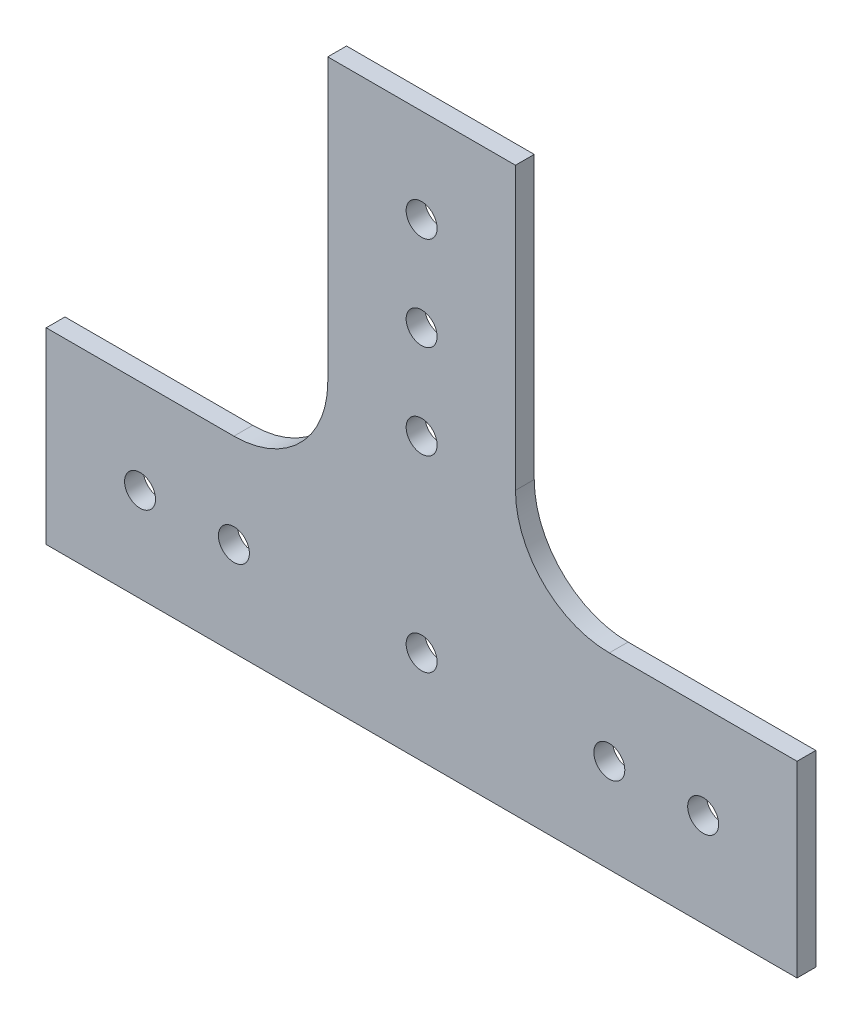
ISO-10303-21;
HEADER;
FILE_DESCRIPTION(('STEP AP214'),'2;1');
FILE_NAME('part.step','',(''),(''),'','','');
FILE_SCHEMA(('AUTOMOTIVE_DESIGN { 1 0 10303 214 1 1 1 1 }'));
ENDSEC;
DATA;
#1=APPLICATION_CONTEXT('core data for automotive mechanical design processes');
#2=APPLICATION_PROTOCOL_DEFINITION('international standard','automotive_design',2000,#1);
#3=PRODUCT_CONTEXT('',#1,'mechanical');
#4=PRODUCT('Part','Part','',(#3));
#5=PRODUCT_RELATED_PRODUCT_CATEGORY('part','',(#4));
#6=PRODUCT_DEFINITION_FORMATION('','',#4);
#7=PRODUCT_DEFINITION_CONTEXT('part definition',#1,'design');
#8=PRODUCT_DEFINITION('design','',#6,#7);
#9=PRODUCT_DEFINITION_SHAPE('','',#8);
#10=(LENGTH_UNIT() NAMED_UNIT(*) SI_UNIT(.MILLI.,.METRE.));
#11=(NAMED_UNIT(*) PLANE_ANGLE_UNIT() SI_UNIT($,.RADIAN.));
#12=(NAMED_UNIT(*) SI_UNIT($,.STERADIAN.) SOLID_ANGLE_UNIT());
#13=UNCERTAINTY_MEASURE_WITH_UNIT(LENGTH_MEASURE(1.E-05),#10,'distance_accuracy_value','');
#14=(GEOMETRIC_REPRESENTATION_CONTEXT(3) GLOBAL_UNCERTAINTY_ASSIGNED_CONTEXT((#13)) GLOBAL_UNIT_ASSIGNED_CONTEXT((#10,
#11,#12)) REPRESENTATION_CONTEXT('',''));
#15=CARTESIAN_POINT('',(0.,0.,0.));
#16=DIRECTION('',(0.,0.,1.));
#17=DIRECTION('',(1.,0.,0.));
#18=AXIS2_PLACEMENT_3D('',#15,#16,#17);
#19=CARTESIAN_POINT('',(0.,0.,2.));
#20=DIRECTION('',(0.,0.,-1.));
#21=DIRECTION('',(-1.,0.,0.));
#22=AXIS2_PLACEMENT_3D('',#19,#20,#21);
#23=PLANE('',#22);
#24=DIRECTION('',(-1.,0.,0.));
#25=VECTOR('',#24,1.);
#26=CARTESIAN_POINT('',(30.,10.,2.));
#27=LINE('',#26,#25);
#28=CARTESIAN_POINT('',(40.,10.,2.));
#29=VERTEX_POINT('',#28);
#30=CARTESIAN_POINT('',(20.,9.99999999999999,2.));
#31=VERTEX_POINT('',#30);
#32=EDGE_CURVE('E129',#29,#31,#27,.T.);
#33=ORIENTED_EDGE('',*,*,#32,.T.);
#34=CARTESIAN_POINT('',(20.,20.,2.));
#35=DIRECTION('',(0.,0.,-1.));
#36=DIRECTION('',(-1.,0.,0.));
#37=AXIS2_PLACEMENT_3D('',#34,#35,#36);
#38=CIRCLE('',#37,10.);
#39=CARTESIAN_POINT('',(10.,20.,2.));
#40=VERTEX_POINT('',#39);
#41=EDGE_CURVE('E125',#31,#40,#38,.T.);
#42=ORIENTED_EDGE('',*,*,#41,.T.);
#43=DIRECTION('',(0.,1.,0.));
#44=VECTOR('',#43,1.);
#45=CARTESIAN_POINT('',(10.,10.,2.));
#46=LINE('',#45,#44);
#47=CARTESIAN_POINT('',(10.,50.,2.));
#48=VERTEX_POINT('',#47);
#49=EDGE_CURVE('E117',#40,#48,#46,.T.);
#50=ORIENTED_EDGE('',*,*,#49,.T.);
#51=DIRECTION('',(-1.,0.,0.));
#52=VECTOR('',#51,1.);
#53=CARTESIAN_POINT('',(-9.99999999999999,50.,2.));
#54=LINE('',#53,#52);
#55=CARTESIAN_POINT('',(-9.99999999999999,50.,2.));
#56=VERTEX_POINT('',#55);
#57=EDGE_CURVE('E122',#48,#56,#54,.T.);
#58=ORIENTED_EDGE('',*,*,#57,.T.);
#59=DIRECTION('',(0.,-1.,0.));
#60=VECTOR('',#59,1.);
#61=CARTESIAN_POINT('',(-9.99999999999999,10.,2.));
#62=LINE('',#61,#60);
#63=CARTESIAN_POINT('',(-9.99999999999999,20.,2.));
#64=VERTEX_POINT('',#63);
#65=EDGE_CURVE('E143',#56,#64,#62,.T.);
#66=ORIENTED_EDGE('',*,*,#65,.T.);
#67=CARTESIAN_POINT('',(-20.,20.,2.));
#68=DIRECTION('',(0.,0.,-1.));
#69=DIRECTION('',(-1.,0.,0.));
#70=AXIS2_PLACEMENT_3D('',#67,#68,#69);
#71=CIRCLE('',#70,10.);
#72=CARTESIAN_POINT('',(-20.,10.,2.));
#73=VERTEX_POINT('',#72);
#74=EDGE_CURVE('E11',#64,#73,#71,.T.);
#75=ORIENTED_EDGE('',*,*,#74,.T.);
#76=DIRECTION('',(-1.,0.,0.));
#77=VECTOR('',#76,1.);
#78=CARTESIAN_POINT('',(-30.,10.,2.));
#79=LINE('',#78,#77);
#80=CARTESIAN_POINT('',(-40.,10.,2.));
#81=VERTEX_POINT('',#80);
#82=EDGE_CURVE('E145',#73,#81,#79,.T.);
#83=ORIENTED_EDGE('',*,*,#82,.T.);
#84=DIRECTION('',(0.,-1.,0.));
#85=VECTOR('',#84,1.);
#86=CARTESIAN_POINT('',(-40.,10.,2.));
#87=LINE('',#86,#85);
#88=CARTESIAN_POINT('',(-40.,-10.,2.));
#89=VERTEX_POINT('',#88);
#90=EDGE_CURVE('E150',#81,#89,#87,.T.);
#91=ORIENTED_EDGE('',*,*,#90,.T.);
#92=DIRECTION('',(1.,0.,0.));
#93=VECTOR('',#92,1.);
#94=CARTESIAN_POINT('',(-40.,-10.,2.));
#95=LINE('',#94,#93);
#96=CARTESIAN_POINT('',(40.,-9.99999999999999,2.));
#97=VERTEX_POINT('',#96);
#98=EDGE_CURVE('E152',#89,#97,#95,.T.);
#99=ORIENTED_EDGE('',*,*,#98,.T.);
#100=DIRECTION('',(0.,1.,0.));
#101=VECTOR('',#100,1.);
#102=CARTESIAN_POINT('',(40.,10.,2.));
#103=LINE('',#102,#101);
#104=EDGE_CURVE('E154',#97,#29,#103,.T.);
#105=ORIENTED_EDGE('',*,*,#104,.T.);
#106=EDGE_LOOP('',(#33,#42,#50,#58,#66,#75,#83,#91,#99,#105));
#107=FACE_BOUND('',#106,.T.);
#108=CARTESIAN_POINT('',(0.,0.,2.));
#109=DIRECTION('',(0.,0.,1.));
#110=DIRECTION('',(1.,0.,0.));
#111=AXIS2_PLACEMENT_3D('',#108,#109,#110);
#112=CIRCLE('',#111,1.65);
#113=CARTESIAN_POINT('',(1.64999999999999,0.,2.));
#114=VERTEX_POINT('',#113);
#115=EDGE_CURVE('E160',#114,#114,#112,.T.);
#116=ORIENTED_EDGE('',*,*,#115,.F.);
#117=EDGE_LOOP('',(#116));
#118=FACE_BOUND('',#117,.T.);
#119=CARTESIAN_POINT('',(-20.,0.,2.));
#120=DIRECTION('',(0.,0.,1.));
#121=DIRECTION('',(1.,0.,0.));
#122=AXIS2_PLACEMENT_3D('',#119,#120,#121);
#123=CIRCLE('',#122,1.65);
#124=CARTESIAN_POINT('',(-18.35,0.,2.));
#125=VERTEX_POINT('',#124);
#126=EDGE_CURVE('E424',#125,#125,#123,.T.);
#127=ORIENTED_EDGE('',*,*,#126,.F.);
#128=EDGE_LOOP('',(#127));
#129=FACE_BOUND('',#128,.T.);
#130=CARTESIAN_POINT('',(20.,0.,2.));
#131=DIRECTION('',(0.,0.,1.));
#132=DIRECTION('',(1.,0.,0.));
#133=AXIS2_PLACEMENT_3D('',#130,#131,#132);
#134=CIRCLE('',#133,1.65);
#135=CARTESIAN_POINT('',(21.65,0.,2.));
#136=VERTEX_POINT('',#135);
#137=EDGE_CURVE('E418',#136,#136,#134,.T.);
#138=ORIENTED_EDGE('',*,*,#137,.F.);
#139=EDGE_LOOP('',(#138));
#140=FACE_BOUND('',#139,.T.);
#141=CARTESIAN_POINT('',(0.,20.,2.));
#142=DIRECTION('',(0.,0.,1.));
#143=DIRECTION('',(1.,0.,0.));
#144=AXIS2_PLACEMENT_3D('',#141,#142,#143);
#145=CIRCLE('',#144,1.65);
#146=CARTESIAN_POINT('',(1.65,20.,2.));
#147=VERTEX_POINT('',#146);
#148=EDGE_CURVE('E412',#147,#147,#145,.T.);
#149=ORIENTED_EDGE('',*,*,#148,.F.);
#150=EDGE_LOOP('',(#149));
#151=FACE_BOUND('',#150,.T.);
#152=CARTESIAN_POINT('',(0.,30.,2.));
#153=DIRECTION('',(0.,0.,1.));
#154=DIRECTION('',(1.,0.,0.));
#155=AXIS2_PLACEMENT_3D('',#152,#153,#154);
#156=CIRCLE('',#155,1.65);
#157=CARTESIAN_POINT('',(1.65,30.,2.));
#158=VERTEX_POINT('',#157);
#159=EDGE_CURVE('E406',#158,#158,#156,.T.);
#160=ORIENTED_EDGE('',*,*,#159,.F.);
#161=EDGE_LOOP('',(#160));
#162=FACE_BOUND('',#161,.T.);
#163=CARTESIAN_POINT('',(0.,40.,2.));
#164=DIRECTION('',(0.,0.,1.));
#165=DIRECTION('',(1.,0.,0.));
#166=AXIS2_PLACEMENT_3D('',#163,#164,#165);
#167=CIRCLE('',#166,1.65);
#168=CARTESIAN_POINT('',(1.65,40.,2.));
#169=VERTEX_POINT('',#168);
#170=EDGE_CURVE('E400',#169,#169,#167,.T.);
#171=ORIENTED_EDGE('',*,*,#170,.F.);
#172=EDGE_LOOP('',(#171));
#173=FACE_BOUND('',#172,.T.);
#174=CARTESIAN_POINT('',(30.,0.,2.));
#175=DIRECTION('',(0.,0.,1.));
#176=DIRECTION('',(1.,0.,0.));
#177=AXIS2_PLACEMENT_3D('',#174,#175,#176);
#178=CIRCLE('',#177,1.65);
#179=CARTESIAN_POINT('',(31.65,0.,2.));
#180=VERTEX_POINT('',#179);
#181=EDGE_CURVE('E387',#180,#180,#178,.T.);
#182=ORIENTED_EDGE('',*,*,#181,.F.);
#183=EDGE_LOOP('',(#182));
#184=FACE_BOUND('',#183,.T.);
#185=CARTESIAN_POINT('',(-30.,0.,2.));
#186=DIRECTION('',(0.,0.,1.));
#187=DIRECTION('',(1.,0.,0.));
#188=AXIS2_PLACEMENT_3D('',#185,#186,#187);
#189=CIRCLE('',#188,1.65);
#190=CARTESIAN_POINT('',(-28.35,0.,2.));
#191=VERTEX_POINT('',#190);
#192=EDGE_CURVE('E391',#191,#191,#189,.T.);
#193=ORIENTED_EDGE('',*,*,#192,.F.);
#194=EDGE_LOOP('',(#193));
#195=FACE_BOUND('',#194,.T.);
#196=ADVANCED_FACE('F41',(#107,#118,#129,#140,#151,#162,#173,#184,#195),#23,.F.);
#197=CARTESIAN_POINT('',(0.,0.,0.));
#198=DIRECTION('',(0.,0.,-1.));
#199=DIRECTION('',(-1.,0.,0.));
#200=AXIS2_PLACEMENT_3D('',#197,#198,#199);
#201=PLANE('',#200);
#202=CARTESIAN_POINT('',(30.,0.,0.));
#203=DIRECTION('',(0.,0.,1.));
#204=DIRECTION('',(1.,0.,0.));
#205=AXIS2_PLACEMENT_3D('',#202,#203,#204);
#206=CIRCLE('',#205,1.65);
#207=CARTESIAN_POINT('',(31.65,0.,0.));
#208=VERTEX_POINT('',#207);
#209=EDGE_CURVE('E390',#208,#208,#206,.T.);
#210=ORIENTED_EDGE('',*,*,#209,.T.);
#211=EDGE_LOOP('',(#210));
#212=FACE_BOUND('',#211,.T.);
#213=CARTESIAN_POINT('',(0.,30.,0.));
#214=DIRECTION('',(0.,0.,1.));
#215=DIRECTION('',(1.,0.,0.));
#216=AXIS2_PLACEMENT_3D('',#213,#214,#215);
#217=CIRCLE('',#216,1.65);
#218=CARTESIAN_POINT('',(1.65,30.,0.));
#219=VERTEX_POINT('',#218);
#220=EDGE_CURVE('E403',#219,#219,#217,.T.);
#221=ORIENTED_EDGE('',*,*,#220,.T.);
#222=EDGE_LOOP('',(#221));
#223=FACE_BOUND('',#222,.T.);
#224=CARTESIAN_POINT('',(20.,0.,0.));
#225=DIRECTION('',(0.,0.,1.));
#226=DIRECTION('',(1.,0.,0.));
#227=AXIS2_PLACEMENT_3D('',#224,#225,#226);
#228=CIRCLE('',#227,1.65);
#229=CARTESIAN_POINT('',(21.65,0.,0.));
#230=VERTEX_POINT('',#229);
#231=EDGE_CURVE('E415',#230,#230,#228,.T.);
#232=ORIENTED_EDGE('',*,*,#231,.T.);
#233=EDGE_LOOP('',(#232));
#234=FACE_BOUND('',#233,.T.);
#235=CARTESIAN_POINT('',(0.,0.,0.));
#236=DIRECTION('',(0.,0.,1.));
#237=DIRECTION('',(1.,0.,0.));
#238=AXIS2_PLACEMENT_3D('',#235,#236,#237);
#239=CIRCLE('',#238,1.65);
#240=CARTESIAN_POINT('',(1.64999999999999,0.,0.));
#241=VERTEX_POINT('',#240);
#242=EDGE_CURVE('E427',#241,#241,#239,.T.);
#243=ORIENTED_EDGE('',*,*,#242,.T.);
#244=EDGE_LOOP('',(#243));
#245=FACE_BOUND('',#244,.T.);
#246=DIRECTION('',(-1.,0.,0.));
#247=VECTOR('',#246,1.);
#248=CARTESIAN_POINT('',(10.,10.,0.));
#249=LINE('',#248,#247);
#250=CARTESIAN_POINT('',(40.,10.,0.));
#251=VERTEX_POINT('',#250);
#252=CARTESIAN_POINT('',(20.,10.,0.));
#253=VERTEX_POINT('',#252);
#254=EDGE_CURVE('E157',#251,#253,#249,.T.);
#255=ORIENTED_EDGE('',*,*,#254,.F.);
#256=DIRECTION('',(0.,1.,0.));
#257=VECTOR('',#256,1.);
#258=CARTESIAN_POINT('',(40.,10.,0.));
#259=LINE('',#258,#257);
#260=CARTESIAN_POINT('',(40.,-9.99999999999999,0.));
#261=VERTEX_POINT('',#260);
#262=EDGE_CURVE('E173',#261,#251,#259,.T.);
#263=ORIENTED_EDGE('',*,*,#262,.F.);
#264=DIRECTION('',(1.,0.,0.));
#265=VECTOR('',#264,1.);
#266=CARTESIAN_POINT('',(40.,-9.99999999999999,0.));
#267=LINE('',#266,#265);
#268=CARTESIAN_POINT('',(-40.,-10.,0.));
#269=VERTEX_POINT('',#268);
#270=EDGE_CURVE('E171',#269,#261,#267,.T.);
#271=ORIENTED_EDGE('',*,*,#270,.F.);
#272=DIRECTION('',(0.,-1.,0.));
#273=VECTOR('',#272,1.);
#274=CARTESIAN_POINT('',(-40.,10.,0.));
#275=LINE('',#274,#273);
#276=CARTESIAN_POINT('',(-40.,10.,0.));
#277=VERTEX_POINT('',#276);
#278=EDGE_CURVE('E168',#277,#269,#275,.T.);
#279=ORIENTED_EDGE('',*,*,#278,.F.);
#280=DIRECTION('',(-1.,0.,0.));
#281=VECTOR('',#280,1.);
#282=CARTESIAN_POINT('',(-30.,10.,0.));
#283=LINE('',#282,#281);
#284=CARTESIAN_POINT('',(-20.,10.,0.));
#285=VERTEX_POINT('',#284);
#286=EDGE_CURVE('E166',#285,#277,#283,.T.);
#287=ORIENTED_EDGE('',*,*,#286,.F.);
#288=CARTESIAN_POINT('',(-20.,20.,0.));
#289=DIRECTION('',(0.,0.,-1.));
#290=DIRECTION('',(-1.,0.,0.));
#291=AXIS2_PLACEMENT_3D('',#288,#289,#290);
#292=CIRCLE('',#291,10.);
#293=CARTESIAN_POINT('',(-9.99999999999999,20.,0.));
#294=VERTEX_POINT('',#293);
#295=EDGE_CURVE('E49',#285,#294,#292,.F.);
#296=ORIENTED_EDGE('',*,*,#295,.T.);
#297=DIRECTION('',(0.,-1.,0.));
#298=VECTOR('',#297,1.);
#299=CARTESIAN_POINT('',(-9.99999999999999,10.,0.));
#300=LINE('',#299,#298);
#301=CARTESIAN_POINT('',(-9.99999999999999,50.,0.));
#302=VERTEX_POINT('',#301);
#303=EDGE_CURVE('E164',#302,#294,#300,.T.);
#304=ORIENTED_EDGE('',*,*,#303,.F.);
#305=DIRECTION('',(-1.,0.,0.));
#306=VECTOR('',#305,1.);
#307=CARTESIAN_POINT('',(-9.99999999999999,50.,0.));
#308=LINE('',#307,#306);
#309=CARTESIAN_POINT('',(10.,50.,0.));
#310=VERTEX_POINT('',#309);
#311=EDGE_CURVE('E162',#310,#302,#308,.T.);
#312=ORIENTED_EDGE('',*,*,#311,.F.);
#313=DIRECTION('',(0.,1.,0.));
#314=VECTOR('',#313,1.);
#315=CARTESIAN_POINT('',(10.,10.,0.));
#316=LINE('',#315,#314);
#317=CARTESIAN_POINT('',(10.,20.,0.));
#318=VERTEX_POINT('',#317);
#319=EDGE_CURVE('E135',#318,#310,#316,.T.);
#320=ORIENTED_EDGE('',*,*,#319,.F.);
#321=CARTESIAN_POINT('',(20.,20.,0.));
#322=DIRECTION('',(0.,0.,-1.));
#323=DIRECTION('',(-1.,0.,0.));
#324=AXIS2_PLACEMENT_3D('',#321,#322,#323);
#325=CIRCLE('',#324,10.);
#326=EDGE_CURVE('E195',#318,#253,#325,.F.);
#327=ORIENTED_EDGE('',*,*,#326,.T.);
#328=EDGE_LOOP('',(#255,#263,#271,#279,#287,#296,#304,#312,#320,#327));
#329=FACE_BOUND('',#328,.T.);
#330=CARTESIAN_POINT('',(-20.,0.,0.));
#331=DIRECTION('',(0.,0.,1.));
#332=DIRECTION('',(1.,0.,0.));
#333=AXIS2_PLACEMENT_3D('',#330,#331,#332);
#334=CIRCLE('',#333,1.65);
#335=CARTESIAN_POINT('',(-18.35,0.,0.));
#336=VERTEX_POINT('',#335);
#337=EDGE_CURVE('E421',#336,#336,#334,.T.);
#338=ORIENTED_EDGE('',*,*,#337,.T.);
#339=EDGE_LOOP('',(#338));
#340=FACE_BOUND('',#339,.T.);
#341=CARTESIAN_POINT('',(0.,20.,0.));
#342=DIRECTION('',(0.,0.,1.));
#343=DIRECTION('',(1.,0.,0.));
#344=AXIS2_PLACEMENT_3D('',#341,#342,#343);
#345=CIRCLE('',#344,1.65);
#346=CARTESIAN_POINT('',(1.65,20.,0.));
#347=VERTEX_POINT('',#346);
#348=EDGE_CURVE('E409',#347,#347,#345,.T.);
#349=ORIENTED_EDGE('',*,*,#348,.T.);
#350=EDGE_LOOP('',(#349));
#351=FACE_BOUND('',#350,.T.);
#352=CARTESIAN_POINT('',(0.,40.,0.));
#353=DIRECTION('',(0.,0.,1.));
#354=DIRECTION('',(1.,0.,0.));
#355=AXIS2_PLACEMENT_3D('',#352,#353,#354);
#356=CIRCLE('',#355,1.65);
#357=CARTESIAN_POINT('',(1.65,40.,0.));
#358=VERTEX_POINT('',#357);
#359=EDGE_CURVE('E393',#358,#358,#356,.T.);
#360=ORIENTED_EDGE('',*,*,#359,.T.);
#361=EDGE_LOOP('',(#360));
#362=FACE_BOUND('',#361,.T.);
#363=CARTESIAN_POINT('',(-30.,0.,0.));
#364=DIRECTION('',(0.,0.,1.));
#365=DIRECTION('',(1.,0.,0.));
#366=AXIS2_PLACEMENT_3D('',#363,#364,#365);
#367=CIRCLE('',#366,1.65);
#368=CARTESIAN_POINT('',(-28.35,0.,0.));
#369=VERTEX_POINT('',#368);
#370=EDGE_CURVE('E396',#369,#369,#367,.T.);
#371=ORIENTED_EDGE('',*,*,#370,.T.);
#372=EDGE_LOOP('',(#371));
#373=FACE_BOUND('',#372,.T.);
#374=ADVANCED_FACE('F197',(#212,#223,#234,#245,#329,#340,#351,#362,#373),#201,.T.);
#375=CARTESIAN_POINT('',(10.,10.,2.));
#376=DIRECTION('',(0.,-1.,0.));
#377=DIRECTION('',(0.,0.,-1.));
#378=AXIS2_PLACEMENT_3D('',#375,#376,#377);
#379=PLANE('',#378);
#380=ORIENTED_EDGE('',*,*,#254,.T.);
#381=DIRECTION('',(0.,0.,-1.));
#382=VECTOR('',#381,1.);
#383=CARTESIAN_POINT('',(20.,10.,2.));
#384=LINE('',#383,#382);
#385=EDGE_CURVE('E189',#253,#31,#384,.F.);
#386=ORIENTED_EDGE('',*,*,#385,.T.);
#387=ORIENTED_EDGE('',*,*,#32,.F.);
#388=DIRECTION('',(0.,0.,-1.));
#389=VECTOR('',#388,1.);
#390=CARTESIAN_POINT('',(40.,10.,2.));
#391=LINE('',#390,#389);
#392=EDGE_CURVE('E156',#29,#251,#391,.T.);
#393=ORIENTED_EDGE('',*,*,#392,.T.);
#394=EDGE_LOOP('',(#380,#386,#387,#393));
#395=FACE_BOUND('',#394,.T.);
#396=ADVANCED_FACE('F203',(#395),#379,.F.);
#397=CARTESIAN_POINT('',(10.,10.,2.));
#398=DIRECTION('',(-1.,0.,0.));
#399=DIRECTION('',(0.,0.,1.));
#400=AXIS2_PLACEMENT_3D('',#397,#398,#399);
#401=PLANE('',#400);
#402=ORIENTED_EDGE('',*,*,#49,.F.);
#403=DIRECTION('',(0.,0.,-1.));
#404=VECTOR('',#403,1.);
#405=CARTESIAN_POINT('',(10.,20.,0.));
#406=LINE('',#405,#404);
#407=EDGE_CURVE('E138',#40,#318,#406,.T.);
#408=ORIENTED_EDGE('',*,*,#407,.T.);
#409=ORIENTED_EDGE('',*,*,#319,.T.);
#410=DIRECTION('',(0.,0.,-1.));
#411=VECTOR('',#410,1.);
#412=CARTESIAN_POINT('',(10.,50.,2.));
#413=LINE('',#412,#411);
#414=EDGE_CURVE('E132',#48,#310,#413,.T.);
#415=ORIENTED_EDGE('',*,*,#414,.F.);
#416=EDGE_LOOP('',(#402,#408,#409,#415));
#417=FACE_BOUND('',#416,.T.);
#418=ADVANCED_FACE('F133',(#417),#401,.F.);
#419=CARTESIAN_POINT('',(-9.99999999999999,50.,2.));
#420=DIRECTION('',(0.,-1.,0.));
#421=DIRECTION('',(0.,0.,-1.));
#422=AXIS2_PLACEMENT_3D('',#419,#420,#421);
#423=PLANE('',#422);
#424=ORIENTED_EDGE('',*,*,#311,.T.);
#425=DIRECTION('',(0.,0.,-1.));
#426=VECTOR('',#425,1.);
#427=CARTESIAN_POINT('',(-9.99999999999999,50.,2.));
#428=LINE('',#427,#426);
#429=EDGE_CURVE('E139',#56,#302,#428,.T.);
#430=ORIENTED_EDGE('',*,*,#429,.F.);
#431=ORIENTED_EDGE('',*,*,#57,.F.);
#432=ORIENTED_EDGE('',*,*,#414,.T.);
#433=EDGE_LOOP('',(#424,#430,#431,#432));
#434=FACE_BOUND('',#433,.T.);
#435=ADVANCED_FACE('F141',(#434),#423,.F.);
#436=CARTESIAN_POINT('',(-9.99999999999999,10.,2.));
#437=DIRECTION('',(1.,0.,0.));
#438=DIRECTION('',(0.,0.,-1.));
#439=AXIS2_PLACEMENT_3D('',#436,#437,#438);
#440=PLANE('',#439);
#441=ORIENTED_EDGE('',*,*,#303,.T.);
#442=DIRECTION('',(0.,0.,-1.));
#443=VECTOR('',#442,1.);
#444=CARTESIAN_POINT('',(-9.99999999999999,20.,2.));
#445=LINE('',#444,#443);
#446=EDGE_CURVE('E56',#294,#64,#445,.F.);
#447=ORIENTED_EDGE('',*,*,#446,.T.);
#448=ORIENTED_EDGE('',*,*,#65,.F.);
#449=ORIENTED_EDGE('',*,*,#429,.T.);
#450=EDGE_LOOP('',(#441,#447,#448,#449));
#451=FACE_BOUND('',#450,.T.);
#452=ADVANCED_FACE('F244',(#451),#440,.F.);
#453=CARTESIAN_POINT('',(-30.,10.,2.));
#454=DIRECTION('',(0.,-1.,0.));
#455=DIRECTION('',(1.,0.,0.));
#456=AXIS2_PLACEMENT_3D('',#453,#454,#455);
#457=PLANE('',#456);
#458=ORIENTED_EDGE('',*,*,#82,.F.);
#459=DIRECTION('',(0.,0.,-1.));
#460=VECTOR('',#459,1.);
#461=CARTESIAN_POINT('',(-20.,10.,0.));
#462=LINE('',#461,#460);
#463=EDGE_CURVE('E191',#73,#285,#462,.T.);
#464=ORIENTED_EDGE('',*,*,#463,.T.);
#465=ORIENTED_EDGE('',*,*,#286,.T.);
#466=DIRECTION('',(0.,0.,-1.));
#467=VECTOR('',#466,1.);
#468=CARTESIAN_POINT('',(-40.,10.,2.));
#469=LINE('',#468,#467);
#470=EDGE_CURVE('E184',#81,#277,#469,.T.);
#471=ORIENTED_EDGE('',*,*,#470,.F.);
#472=EDGE_LOOP('',(#458,#464,#465,#471));
#473=FACE_BOUND('',#472,.T.);
#474=ADVANCED_FACE('F241',(#473),#457,.F.);
#475=CARTESIAN_POINT('',(-40.,10.,2.));
#476=DIRECTION('',(1.,0.,0.));
#477=DIRECTION('',(0.,0.,-1.));
#478=AXIS2_PLACEMENT_3D('',#475,#476,#477);
#479=PLANE('',#478);
#480=ORIENTED_EDGE('',*,*,#278,.T.);
#481=DIRECTION('',(0.,0.,-1.));
#482=VECTOR('',#481,1.);
#483=CARTESIAN_POINT('',(-40.,-10.,2.));
#484=LINE('',#483,#482);
#485=EDGE_CURVE('E181',#89,#269,#484,.T.);
#486=ORIENTED_EDGE('',*,*,#485,.F.);
#487=ORIENTED_EDGE('',*,*,#90,.F.);
#488=ORIENTED_EDGE('',*,*,#470,.T.);
#489=EDGE_LOOP('',(#480,#486,#487,#488));
#490=FACE_BOUND('',#489,.T.);
#491=ADVANCED_FACE('F237',(#490),#479,.F.);
#492=CARTESIAN_POINT('',(40.,-9.99999999999999,2.));
#493=DIRECTION('',(0.,1.,0.));
#494=DIRECTION('',(-1.,0.,0.));
#495=AXIS2_PLACEMENT_3D('',#492,#493,#494);
#496=PLANE('',#495);
#497=ORIENTED_EDGE('',*,*,#270,.T.);
#498=DIRECTION('',(0.,0.,-1.));
#499=VECTOR('',#498,1.);
#500=CARTESIAN_POINT('',(40.,-9.99999999999999,2.));
#501=LINE('',#500,#499);
#502=EDGE_CURVE('E178',#97,#261,#501,.T.);
#503=ORIENTED_EDGE('',*,*,#502,.F.);
#504=ORIENTED_EDGE('',*,*,#98,.F.);
#505=ORIENTED_EDGE('',*,*,#485,.T.);
#506=EDGE_LOOP('',(#497,#503,#504,#505));
#507=FACE_BOUND('',#506,.T.);
#508=ADVANCED_FACE('F233',(#507),#496,.F.);
#509=CARTESIAN_POINT('',(40.,10.,2.));
#510=DIRECTION('',(-1.,0.,0.));
#511=DIRECTION('',(0.,0.,1.));
#512=AXIS2_PLACEMENT_3D('',#509,#510,#511);
#513=PLANE('',#512);
#514=ORIENTED_EDGE('',*,*,#262,.T.);
#515=ORIENTED_EDGE('',*,*,#392,.F.);
#516=ORIENTED_EDGE('',*,*,#104,.F.);
#517=ORIENTED_EDGE('',*,*,#502,.T.);
#518=EDGE_LOOP('',(#514,#515,#516,#517));
#519=FACE_BOUND('',#518,.T.);
#520=ADVANCED_FACE('F230',(#519),#513,.F.);
#521=CARTESIAN_POINT('',(0.,0.,2.));
#522=DIRECTION('',(0.,0.,-1.));
#523=DIRECTION('',(-1.,0.,0.));
#524=AXIS2_PLACEMENT_3D('',#521,#522,#523);
#525=CYLINDRICAL_SURFACE('',#524,1.65);
#526=ORIENTED_EDGE('',*,*,#115,.T.);
#527=EDGE_LOOP('',(#526));
#528=FACE_BOUND('',#527,.T.);
#529=ORIENTED_EDGE('',*,*,#242,.F.);
#530=EDGE_LOOP('',(#529));
#531=FACE_BOUND('',#530,.T.);
#532=ADVANCED_FACE('F227',(#528,#531),#525,.F.);
#533=CARTESIAN_POINT('',(-20.,0.,2.));
#534=DIRECTION('',(0.,0.,-1.));
#535=DIRECTION('',(-1.,0.,0.));
#536=AXIS2_PLACEMENT_3D('',#533,#534,#535);
#537=CYLINDRICAL_SURFACE('',#536,1.65);
#538=ORIENTED_EDGE('',*,*,#126,.T.);
#539=EDGE_LOOP('',(#538));
#540=FACE_BOUND('',#539,.T.);
#541=ORIENTED_EDGE('',*,*,#337,.F.);
#542=EDGE_LOOP('',(#541));
#543=FACE_BOUND('',#542,.T.);
#544=ADVANCED_FACE('F308',(#540,#543),#537,.F.);
#545=CARTESIAN_POINT('',(20.,0.,2.));
#546=DIRECTION('',(0.,0.,-1.));
#547=DIRECTION('',(-1.,0.,0.));
#548=AXIS2_PLACEMENT_3D('',#545,#546,#547);
#549=CYLINDRICAL_SURFACE('',#548,1.65);
#550=ORIENTED_EDGE('',*,*,#137,.T.);
#551=EDGE_LOOP('',(#550));
#552=FACE_BOUND('',#551,.T.);
#553=ORIENTED_EDGE('',*,*,#231,.F.);
#554=EDGE_LOOP('',(#553));
#555=FACE_BOUND('',#554,.T.);
#556=ADVANCED_FACE('F317',(#552,#555),#549,.F.);
#557=CARTESIAN_POINT('',(0.,20.,2.));
#558=DIRECTION('',(0.,0.,-1.));
#559=DIRECTION('',(-1.,0.,0.));
#560=AXIS2_PLACEMENT_3D('',#557,#558,#559);
#561=CYLINDRICAL_SURFACE('',#560,1.65);
#562=ORIENTED_EDGE('',*,*,#148,.T.);
#563=EDGE_LOOP('',(#562));
#564=FACE_BOUND('',#563,.T.);
#565=ORIENTED_EDGE('',*,*,#348,.F.);
#566=EDGE_LOOP('',(#565));
#567=FACE_BOUND('',#566,.T.);
#568=ADVANCED_FACE('F326',(#564,#567),#561,.F.);
#569=CARTESIAN_POINT('',(0.,30.,2.));
#570=DIRECTION('',(0.,0.,-1.));
#571=DIRECTION('',(-1.,0.,0.));
#572=AXIS2_PLACEMENT_3D('',#569,#570,#571);
#573=CYLINDRICAL_SURFACE('',#572,1.65);
#574=ORIENTED_EDGE('',*,*,#159,.T.);
#575=EDGE_LOOP('',(#574));
#576=FACE_BOUND('',#575,.T.);
#577=ORIENTED_EDGE('',*,*,#220,.F.);
#578=EDGE_LOOP('',(#577));
#579=FACE_BOUND('',#578,.T.);
#580=ADVANCED_FACE('F336',(#576,#579),#573,.F.);
#581=CARTESIAN_POINT('',(0.,40.,2.));
#582=DIRECTION('',(0.,0.,-1.));
#583=DIRECTION('',(-1.,0.,0.));
#584=AXIS2_PLACEMENT_3D('',#581,#582,#583);
#585=CYLINDRICAL_SURFACE('',#584,1.65);
#586=ORIENTED_EDGE('',*,*,#170,.T.);
#587=EDGE_LOOP('',(#586));
#588=FACE_BOUND('',#587,.T.);
#589=ORIENTED_EDGE('',*,*,#359,.F.);
#590=EDGE_LOOP('',(#589));
#591=FACE_BOUND('',#590,.T.);
#592=ADVANCED_FACE('F346',(#588,#591),#585,.F.);
#593=CARTESIAN_POINT('',(30.,0.,2.));
#594=DIRECTION('',(0.,0.,-1.));
#595=DIRECTION('',(-1.,0.,0.));
#596=AXIS2_PLACEMENT_3D('',#593,#594,#595);
#597=CYLINDRICAL_SURFACE('',#596,1.65);
#598=ORIENTED_EDGE('',*,*,#181,.T.);
#599=EDGE_LOOP('',(#598));
#600=FACE_BOUND('',#599,.T.);
#601=ORIENTED_EDGE('',*,*,#209,.F.);
#602=EDGE_LOOP('',(#601));
#603=FACE_BOUND('',#602,.T.);
#604=ADVANCED_FACE('F215',(#600,#603),#597,.F.);
#605=CARTESIAN_POINT('',(-30.,0.,2.));
#606=DIRECTION('',(0.,0.,-1.));
#607=DIRECTION('',(-1.,0.,0.));
#608=AXIS2_PLACEMENT_3D('',#605,#606,#607);
#609=CYLINDRICAL_SURFACE('',#608,1.65);
#610=ORIENTED_EDGE('',*,*,#192,.T.);
#611=EDGE_LOOP('',(#610));
#612=FACE_BOUND('',#611,.T.);
#613=ORIENTED_EDGE('',*,*,#370,.F.);
#614=EDGE_LOOP('',(#613));
#615=FACE_BOUND('',#614,.T.);
#616=ADVANCED_FACE('F208',(#612,#615),#609,.F.);
#617=CARTESIAN_POINT('',(20.,20.,2.));
#618=DIRECTION('',(0.,0.,1.));
#619=DIRECTION('',(1.,0.,0.));
#620=AXIS2_PLACEMENT_3D('',#617,#618,#619);
#621=CYLINDRICAL_SURFACE('',#620,10.);
#622=ORIENTED_EDGE('',*,*,#41,.F.);
#623=ORIENTED_EDGE('',*,*,#385,.F.);
#624=ORIENTED_EDGE('',*,*,#326,.F.);
#625=ORIENTED_EDGE('',*,*,#407,.F.);
#626=EDGE_LOOP('',(#622,#623,#624,#625));
#627=FACE_BOUND('',#626,.T.);
#628=ADVANCED_FACE('F206',(#627),#621,.F.);
#629=CARTESIAN_POINT('',(-20.,20.,2.));
#630=DIRECTION('',(0.,0.,1.));
#631=DIRECTION('',(1.,0.,0.));
#632=AXIS2_PLACEMENT_3D('',#629,#630,#631);
#633=CYLINDRICAL_SURFACE('',#632,10.);
#634=ORIENTED_EDGE('',*,*,#74,.F.);
#635=ORIENTED_EDGE('',*,*,#446,.F.);
#636=ORIENTED_EDGE('',*,*,#295,.F.);
#637=ORIENTED_EDGE('',*,*,#463,.F.);
#638=EDGE_LOOP('',(#634,#635,#636,#637));
#639=FACE_BOUND('',#638,.T.);
#640=ADVANCED_FACE('F43',(#639),#633,.F.);
#641=CLOSED_SHELL('',(#196,#374,#396,#418,#435,#452,#474,#491,#508,#520,#532,#544,#556,#568,
#580,#592,#604,#616,#628,#640));
#642=MANIFOLD_SOLID_BREP('B2',#641);
#643=ADVANCED_BREP_SHAPE_REPRESENTATION('',(#18,#642),#14);
#644=SHAPE_DEFINITION_REPRESENTATION(#9,#643);
ENDSEC;
END-ISO-10303-21;
